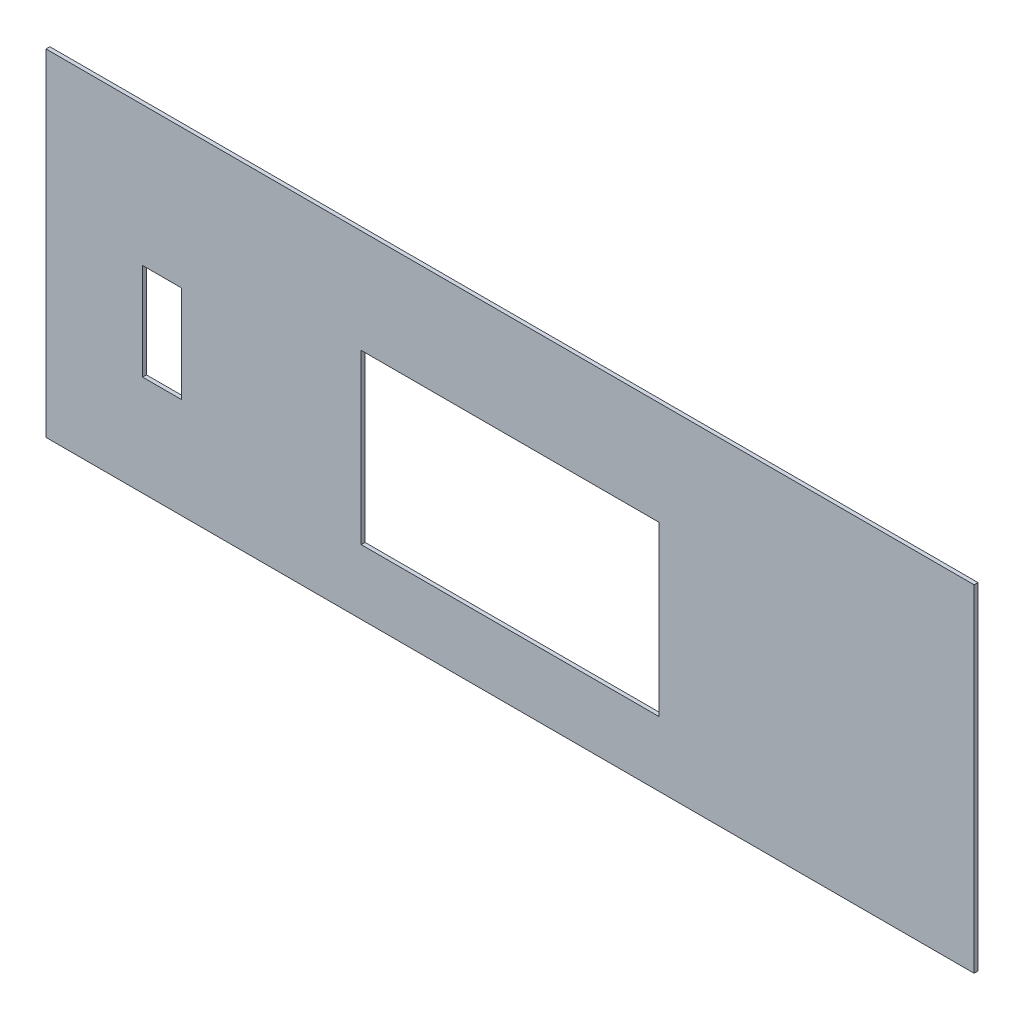
ISO-10303-21;
HEADER;
FILE_DESCRIPTION(('STEP AP214'),'2;1');
FILE_NAME('part.step','',(''),(''),'','','');
FILE_SCHEMA(('AUTOMOTIVE_DESIGN { 1 0 10303 214 1 1 1 1 }'));
ENDSEC;
DATA;
#1=APPLICATION_CONTEXT('core data for automotive mechanical design processes');
#2=APPLICATION_PROTOCOL_DEFINITION('international standard','automotive_design',2000,#1);
#3=PRODUCT_CONTEXT('',#1,'mechanical');
#4=PRODUCT('Part','Part','',(#3));
#5=PRODUCT_RELATED_PRODUCT_CATEGORY('part','',(#4));
#6=PRODUCT_DEFINITION_FORMATION('','',#4);
#7=PRODUCT_DEFINITION_CONTEXT('part definition',#1,'design');
#8=PRODUCT_DEFINITION('design','',#6,#7);
#9=PRODUCT_DEFINITION_SHAPE('','',#8);
#10=(LENGTH_UNIT() NAMED_UNIT(*) SI_UNIT(.MILLI.,.METRE.));
#11=(NAMED_UNIT(*) PLANE_ANGLE_UNIT() SI_UNIT($,.RADIAN.));
#12=(NAMED_UNIT(*) SI_UNIT($,.STERADIAN.) SOLID_ANGLE_UNIT());
#13=UNCERTAINTY_MEASURE_WITH_UNIT(LENGTH_MEASURE(1.E-05),#10,'distance_accuracy_value','');
#14=(GEOMETRIC_REPRESENTATION_CONTEXT(3) GLOBAL_UNCERTAINTY_ASSIGNED_CONTEXT((#13)) GLOBAL_UNIT_ASSIGNED_CONTEXT((#10,
#11,#12)) REPRESENTATION_CONTEXT('',''));
#15=CARTESIAN_POINT('',(0.,0.,0.));
#16=DIRECTION('',(0.,0.,1.));
#17=DIRECTION('',(1.,0.,0.));
#18=AXIS2_PLACEMENT_3D('',#15,#16,#17);
#19=CARTESIAN_POINT('',(240.,-87.,-2.));
#20=DIRECTION('',(1.,0.,0.));
#21=DIRECTION('',(0.,0.,-1.));
#22=AXIS2_PLACEMENT_3D('',#19,#20,#21);
#23=PLANE('',#22);
#24=DIRECTION('',(0.,1.,0.));
#25=VECTOR('',#24,1.);
#26=CARTESIAN_POINT('',(240.,-87.,0.));
#27=LINE('',#26,#25);
#28=CARTESIAN_POINT('',(240.,-87.,0.));
#29=VERTEX_POINT('',#28);
#30=CARTESIAN_POINT('',(240.,87.,0.));
#31=VERTEX_POINT('',#30);
#32=EDGE_CURVE('E184',#29,#31,#27,.T.);
#33=ORIENTED_EDGE('',*,*,#32,.F.);
#34=DIRECTION('',(0.,0.,1.));
#35=VECTOR('',#34,1.);
#36=CARTESIAN_POINT('',(240.,-87.,-2.));
#37=LINE('',#36,#35);
#38=CARTESIAN_POINT('',(240.,-87.,-2.));
#39=VERTEX_POINT('',#38);
#40=EDGE_CURVE('E11',#39,#29,#37,.T.);
#41=ORIENTED_EDGE('',*,*,#40,.F.);
#42=DIRECTION('',(0.,1.,0.));
#43=VECTOR('',#42,1.);
#44=CARTESIAN_POINT('',(240.,-87.,-2.));
#45=LINE('',#44,#43);
#46=CARTESIAN_POINT('',(240.,87.,-2.));
#47=VERTEX_POINT('',#46);
#48=EDGE_CURVE('E191',#39,#47,#45,.T.);
#49=ORIENTED_EDGE('',*,*,#48,.T.);
#50=DIRECTION('',(0.,0.,1.));
#51=VECTOR('',#50,1.);
#52=CARTESIAN_POINT('',(240.,87.,-2.));
#53=LINE('',#52,#51);
#54=EDGE_CURVE('E36',#47,#31,#53,.T.);
#55=ORIENTED_EDGE('',*,*,#54,.T.);
#56=EDGE_LOOP('',(#33,#41,#49,#55));
#57=FACE_BOUND('',#56,.T.);
#58=ADVANCED_FACE('F33',(#57),#23,.T.);
#59=CARTESIAN_POINT('',(-240.,-87.,-2.));
#60=DIRECTION('',(0.,-1.,0.));
#61=DIRECTION('',(0.,0.,-1.));
#62=AXIS2_PLACEMENT_3D('',#59,#60,#61);
#63=PLANE('',#62);
#64=DIRECTION('',(1.,0.,0.));
#65=VECTOR('',#64,1.);
#66=CARTESIAN_POINT('',(-240.,-87.,0.));
#67=LINE('',#66,#65);
#68=CARTESIAN_POINT('',(-240.,-87.,0.));
#69=VERTEX_POINT('',#68);
#70=EDGE_CURVE('E195',#69,#29,#67,.T.);
#71=ORIENTED_EDGE('',*,*,#70,.F.);
#72=DIRECTION('',(0.,0.,1.));
#73=VECTOR('',#72,1.);
#74=CARTESIAN_POINT('',(-240.,-87.,-2.));
#75=LINE('',#74,#73);
#76=CARTESIAN_POINT('',(-240.,-87.,-2.));
#77=VERTEX_POINT('',#76);
#78=EDGE_CURVE('E41',#77,#69,#75,.T.);
#79=ORIENTED_EDGE('',*,*,#78,.F.);
#80=DIRECTION('',(1.,0.,0.));
#81=VECTOR('',#80,1.);
#82=CARTESIAN_POINT('',(-240.,-87.,-2.));
#83=LINE('',#82,#81);
#84=EDGE_CURVE('E201',#77,#39,#83,.T.);
#85=ORIENTED_EDGE('',*,*,#84,.T.);
#86=ORIENTED_EDGE('',*,*,#40,.T.);
#87=EDGE_LOOP('',(#71,#79,#85,#86));
#88=FACE_BOUND('',#87,.T.);
#89=ADVANCED_FACE('F227',(#88),#63,.T.);
#90=CARTESIAN_POINT('',(-240.,-87.,-2.));
#91=DIRECTION('',(-1.,0.,0.));
#92=DIRECTION('',(0.,0.,1.));
#93=AXIS2_PLACEMENT_3D('',#90,#91,#92);
#94=PLANE('',#93);
#95=DIRECTION('',(0.,-1.,0.));
#96=VECTOR('',#95,1.);
#97=CARTESIAN_POINT('',(-240.,-87.,0.));
#98=LINE('',#97,#96);
#99=CARTESIAN_POINT('',(-240.,87.,0.));
#100=VERTEX_POINT('',#99);
#101=EDGE_CURVE('E209',#100,#69,#98,.T.);
#102=ORIENTED_EDGE('',*,*,#101,.F.);
#103=DIRECTION('',(0.,0.,1.));
#104=VECTOR('',#103,1.);
#105=CARTESIAN_POINT('',(-240.,87.,-2.));
#106=LINE('',#105,#104);
#107=CARTESIAN_POINT('',(-240.,87.,-2.));
#108=VERTEX_POINT('',#107);
#109=EDGE_CURVE('E214',#108,#100,#106,.T.);
#110=ORIENTED_EDGE('',*,*,#109,.F.);
#111=DIRECTION('',(0.,-1.,0.));
#112=VECTOR('',#111,1.);
#113=CARTESIAN_POINT('',(-240.,-87.,-2.));
#114=LINE('',#113,#112);
#115=EDGE_CURVE('E198',#108,#77,#114,.T.);
#116=ORIENTED_EDGE('',*,*,#115,.T.);
#117=ORIENTED_EDGE('',*,*,#78,.T.);
#118=EDGE_LOOP('',(#102,#110,#116,#117));
#119=FACE_BOUND('',#118,.T.);
#120=ADVANCED_FACE('F232',(#119),#94,.T.);
#121=CARTESIAN_POINT('',(-240.,87.,-2.));
#122=DIRECTION('',(0.,1.,0.));
#123=DIRECTION('',(0.,0.,1.));
#124=AXIS2_PLACEMENT_3D('',#121,#122,#123);
#125=PLANE('',#124);
#126=DIRECTION('',(-1.,0.,0.));
#127=VECTOR('',#126,1.);
#128=CARTESIAN_POINT('',(-240.,87.,0.));
#129=LINE('',#128,#127);
#130=EDGE_CURVE('E206',#31,#100,#129,.T.);
#131=ORIENTED_EDGE('',*,*,#130,.F.);
#132=ORIENTED_EDGE('',*,*,#54,.F.);
#133=DIRECTION('',(-1.,0.,0.));
#134=VECTOR('',#133,1.);
#135=CARTESIAN_POINT('',(-240.,87.,-2.));
#136=LINE('',#135,#134);
#137=EDGE_CURVE('E194',#47,#108,#136,.T.);
#138=ORIENTED_EDGE('',*,*,#137,.T.);
#139=ORIENTED_EDGE('',*,*,#109,.T.);
#140=EDGE_LOOP('',(#131,#132,#138,#139));
#141=FACE_BOUND('',#140,.T.);
#142=ADVANCED_FACE('F222',(#141),#125,.T.);
#143=CARTESIAN_POINT('',(0.,0.,-2.));
#144=DIRECTION('',(0.,0.,-1.));
#145=DIRECTION('',(-1.,0.,0.));
#146=AXIS2_PLACEMENT_3D('',#143,#144,#145);
#147=PLANE('',#146);
#148=DIRECTION('',(0.,-1.,0.));
#149=VECTOR('',#148,1.);
#150=CARTESIAN_POINT('',(-190.,-35.,-2.));
#151=LINE('',#150,#149);
#152=CARTESIAN_POINT('',(-190.,15.,-2.));
#153=VERTEX_POINT('',#152);
#154=CARTESIAN_POINT('',(-190.,-35.,-2.));
#155=VERTEX_POINT('',#154);
#156=EDGE_CURVE('E124',#153,#155,#151,.T.);
#157=ORIENTED_EDGE('',*,*,#156,.T.);
#158=DIRECTION('',(1.,0.,0.));
#159=VECTOR('',#158,1.);
#160=CARTESIAN_POINT('',(-190.,-35.,-2.));
#161=LINE('',#160,#159);
#162=CARTESIAN_POINT('',(-170.,-35.,-2.));
#163=VERTEX_POINT('',#162);
#164=EDGE_CURVE('E133',#155,#163,#161,.T.);
#165=ORIENTED_EDGE('',*,*,#164,.T.);
#166=DIRECTION('',(0.,1.,0.));
#167=VECTOR('',#166,1.);
#168=CARTESIAN_POINT('',(-170.,-35.,-2.));
#169=LINE('',#168,#167);
#170=CARTESIAN_POINT('',(-170.,15.,-2.));
#171=VERTEX_POINT('',#170);
#172=EDGE_CURVE('E49',#163,#171,#169,.T.);
#173=ORIENTED_EDGE('',*,*,#172,.T.);
#174=DIRECTION('',(-1.,0.,0.));
#175=VECTOR('',#174,1.);
#176=CARTESIAN_POINT('',(-190.,15.,-2.));
#177=LINE('',#176,#175);
#178=EDGE_CURVE('E130',#171,#153,#177,.T.);
#179=ORIENTED_EDGE('',*,*,#178,.T.);
#180=EDGE_LOOP('',(#157,#165,#173,#179));
#181=FACE_BOUND('',#180,.T.);
#182=DIRECTION('',(0.,1.,0.));
#183=VECTOR('',#182,1.);
#184=CARTESIAN_POINT('',(77.,33.5,-2.));
#185=LINE('',#184,#183);
#186=CARTESIAN_POINT('',(77.,-53.5,-2.));
#187=VERTEX_POINT('',#186);
#188=CARTESIAN_POINT('',(77.,33.5,-2.));
#189=VERTEX_POINT('',#188);
#190=EDGE_CURVE('E159',#187,#189,#185,.T.);
#191=ORIENTED_EDGE('',*,*,#190,.T.);
#192=DIRECTION('',(-1.,0.,0.));
#193=VECTOR('',#192,1.);
#194=CARTESIAN_POINT('',(-77.,33.5,-2.));
#195=LINE('',#194,#193);
#196=CARTESIAN_POINT('',(-77.,33.5,-2.));
#197=VERTEX_POINT('',#196);
#198=EDGE_CURVE('E162',#189,#197,#195,.T.);
#199=ORIENTED_EDGE('',*,*,#198,.T.);
#200=DIRECTION('',(0.,-1.,0.));
#201=VECTOR('',#200,1.);
#202=CARTESIAN_POINT('',(-77.,33.5,-2.));
#203=LINE('',#202,#201);
#204=CARTESIAN_POINT('',(-77.,-53.5,-2.));
#205=VERTEX_POINT('',#204);
#206=EDGE_CURVE('E166',#197,#205,#203,.T.);
#207=ORIENTED_EDGE('',*,*,#206,.T.);
#208=DIRECTION('',(1.,0.,0.));
#209=VECTOR('',#208,1.);
#210=CARTESIAN_POINT('',(-77.,-53.5,-2.));
#211=LINE('',#210,#209);
#212=EDGE_CURVE('E169',#205,#187,#211,.T.);
#213=ORIENTED_EDGE('',*,*,#212,.T.);
#214=EDGE_LOOP('',(#191,#199,#207,#213));
#215=FACE_BOUND('',#214,.T.);
#216=ORIENTED_EDGE('',*,*,#48,.F.);
#217=ORIENTED_EDGE('',*,*,#84,.F.);
#218=ORIENTED_EDGE('',*,*,#115,.F.);
#219=ORIENTED_EDGE('',*,*,#137,.F.);
#220=EDGE_LOOP('',(#216,#217,#218,#219));
#221=FACE_BOUND('',#220,.T.);
#222=ADVANCED_FACE('F137',(#181,#215,#221),#147,.T.);
#223=CARTESIAN_POINT('',(0.,0.,0.));
#224=DIRECTION('',(0.,0.,-1.));
#225=DIRECTION('',(-1.,0.,0.));
#226=AXIS2_PLACEMENT_3D('',#223,#224,#225);
#227=PLANE('',#226);
#228=DIRECTION('',(1.,0.,0.));
#229=VECTOR('',#228,1.);
#230=CARTESIAN_POINT('',(-190.,-35.,0.));
#231=LINE('',#230,#229);
#232=CARTESIAN_POINT('',(-190.,-35.,0.));
#233=VERTEX_POINT('',#232);
#234=CARTESIAN_POINT('',(-170.,-35.,0.));
#235=VERTEX_POINT('',#234);
#236=EDGE_CURVE('E149',#233,#235,#231,.T.);
#237=ORIENTED_EDGE('',*,*,#236,.F.);
#238=DIRECTION('',(0.,-1.,0.));
#239=VECTOR('',#238,1.);
#240=CARTESIAN_POINT('',(-190.,-35.,0.));
#241=LINE('',#240,#239);
#242=CARTESIAN_POINT('',(-190.,15.,0.));
#243=VERTEX_POINT('',#242);
#244=EDGE_CURVE('E57',#243,#233,#241,.T.);
#245=ORIENTED_EDGE('',*,*,#244,.F.);
#246=DIRECTION('',(-1.,0.,0.));
#247=VECTOR('',#246,1.);
#248=CARTESIAN_POINT('',(-190.,15.,0.));
#249=LINE('',#248,#247);
#250=CARTESIAN_POINT('',(-170.,15.,0.));
#251=VERTEX_POINT('',#250);
#252=EDGE_CURVE('E140',#251,#243,#249,.T.);
#253=ORIENTED_EDGE('',*,*,#252,.F.);
#254=DIRECTION('',(0.,1.,0.));
#255=VECTOR('',#254,1.);
#256=CARTESIAN_POINT('',(-170.,-35.,0.));
#257=LINE('',#256,#255);
#258=EDGE_CURVE('E143',#235,#251,#257,.T.);
#259=ORIENTED_EDGE('',*,*,#258,.F.);
#260=EDGE_LOOP('',(#237,#245,#253,#259));
#261=FACE_BOUND('',#260,.T.);
#262=DIRECTION('',(-1.,0.,0.));
#263=VECTOR('',#262,1.);
#264=CARTESIAN_POINT('',(-77.,33.5,0.));
#265=LINE('',#264,#263);
#266=CARTESIAN_POINT('',(77.,33.5,0.));
#267=VERTEX_POINT('',#266);
#268=CARTESIAN_POINT('',(-77.,33.5,0.));
#269=VERTEX_POINT('',#268);
#270=EDGE_CURVE('E174',#267,#269,#265,.T.);
#271=ORIENTED_EDGE('',*,*,#270,.F.);
#272=DIRECTION('',(0.,1.,0.));
#273=VECTOR('',#272,1.);
#274=CARTESIAN_POINT('',(77.,33.5,0.));
#275=LINE('',#274,#273);
#276=CARTESIAN_POINT('',(77.,-53.5,0.));
#277=VERTEX_POINT('',#276);
#278=EDGE_CURVE('E155',#277,#267,#275,.T.);
#279=ORIENTED_EDGE('',*,*,#278,.F.);
#280=DIRECTION('',(1.,0.,0.));
#281=VECTOR('',#280,1.);
#282=CARTESIAN_POINT('',(-77.,-53.5,0.));
#283=LINE('',#282,#281);
#284=CARTESIAN_POINT('',(-77.,-53.5,0.));
#285=VERTEX_POINT('',#284);
#286=EDGE_CURVE('E163',#285,#277,#283,.T.);
#287=ORIENTED_EDGE('',*,*,#286,.F.);
#288=DIRECTION('',(0.,-1.,0.));
#289=VECTOR('',#288,1.);
#290=CARTESIAN_POINT('',(-77.,33.5,0.));
#291=LINE('',#290,#289);
#292=EDGE_CURVE('E177',#269,#285,#291,.T.);
#293=ORIENTED_EDGE('',*,*,#292,.F.);
#294=EDGE_LOOP('',(#271,#279,#287,#293));
#295=FACE_BOUND('',#294,.T.);
#296=ORIENTED_EDGE('',*,*,#32,.T.);
#297=ORIENTED_EDGE('',*,*,#130,.T.);
#298=ORIENTED_EDGE('',*,*,#101,.T.);
#299=ORIENTED_EDGE('',*,*,#70,.T.);
#300=EDGE_LOOP('',(#296,#297,#298,#299));
#301=FACE_BOUND('',#300,.T.);
#302=ADVANCED_FACE('F224',(#261,#295,#301),#227,.F.);
#303=CARTESIAN_POINT('',(77.,33.5,-2.));
#304=DIRECTION('',(1.,0.,0.));
#305=DIRECTION('',(0.,1.,0.));
#306=AXIS2_PLACEMENT_3D('',#303,#304,#305);
#307=PLANE('',#306);
#308=ORIENTED_EDGE('',*,*,#278,.T.);
#309=DIRECTION('',(0.,0.,1.));
#310=VECTOR('',#309,1.);
#311=CARTESIAN_POINT('',(77.,33.5,-2.));
#312=LINE('',#311,#310);
#313=EDGE_CURVE('E172',#189,#267,#312,.T.);
#314=ORIENTED_EDGE('',*,*,#313,.F.);
#315=ORIENTED_EDGE('',*,*,#190,.F.);
#316=DIRECTION('',(0.,0.,1.));
#317=VECTOR('',#316,1.);
#318=CARTESIAN_POINT('',(77.,-53.5,-2.));
#319=LINE('',#318,#317);
#320=EDGE_CURVE('E182',#187,#277,#319,.T.);
#321=ORIENTED_EDGE('',*,*,#320,.T.);
#322=EDGE_LOOP('',(#308,#314,#315,#321));
#323=FACE_BOUND('',#322,.T.);
#324=ADVANCED_FACE('F274',(#323),#307,.F.);
#325=CARTESIAN_POINT('',(-77.,-53.5,-2.));
#326=DIRECTION('',(0.,-1.,0.));
#327=DIRECTION('',(0.,0.,-1.));
#328=AXIS2_PLACEMENT_3D('',#325,#326,#327);
#329=PLANE('',#328);
#330=ORIENTED_EDGE('',*,*,#286,.T.);
#331=ORIENTED_EDGE('',*,*,#320,.F.);
#332=ORIENTED_EDGE('',*,*,#212,.F.);
#333=DIRECTION('',(0.,0.,1.));
#334=VECTOR('',#333,1.);
#335=CARTESIAN_POINT('',(-77.,-53.5,-2.));
#336=LINE('',#335,#334);
#337=EDGE_CURVE('E185',#205,#285,#336,.T.);
#338=ORIENTED_EDGE('',*,*,#337,.T.);
#339=EDGE_LOOP('',(#330,#331,#332,#338));
#340=FACE_BOUND('',#339,.T.);
#341=ADVANCED_FACE('F284',(#340),#329,.F.);
#342=CARTESIAN_POINT('',(-77.,33.5,-2.));
#343=DIRECTION('',(-1.,0.,0.));
#344=DIRECTION('',(0.,-1.,0.));
#345=AXIS2_PLACEMENT_3D('',#342,#343,#344);
#346=PLANE('',#345);
#347=ORIENTED_EDGE('',*,*,#292,.T.);
#348=ORIENTED_EDGE('',*,*,#337,.F.);
#349=ORIENTED_EDGE('',*,*,#206,.F.);
#350=DIRECTION('',(0.,0.,1.));
#351=VECTOR('',#350,1.);
#352=CARTESIAN_POINT('',(-77.,33.5,-2.));
#353=LINE('',#352,#351);
#354=EDGE_CURVE('E187',#197,#269,#353,.T.);
#355=ORIENTED_EDGE('',*,*,#354,.T.);
#356=EDGE_LOOP('',(#347,#348,#349,#355));
#357=FACE_BOUND('',#356,.T.);
#358=ADVANCED_FACE('F294',(#357),#346,.F.);
#359=CARTESIAN_POINT('',(-77.,33.5,-2.));
#360=DIRECTION('',(0.,1.,0.));
#361=DIRECTION('',(0.,0.,1.));
#362=AXIS2_PLACEMENT_3D('',#359,#360,#361);
#363=PLANE('',#362);
#364=ORIENTED_EDGE('',*,*,#270,.T.);
#365=ORIENTED_EDGE('',*,*,#354,.F.);
#366=ORIENTED_EDGE('',*,*,#198,.F.);
#367=ORIENTED_EDGE('',*,*,#313,.T.);
#368=EDGE_LOOP('',(#364,#365,#366,#367));
#369=FACE_BOUND('',#368,.T.);
#370=ADVANCED_FACE('F304',(#369),#363,.F.);
#371=CARTESIAN_POINT('',(-190.,-35.,-2.));
#372=DIRECTION('',(-1.,0.,0.));
#373=DIRECTION('',(0.,0.,1.));
#374=AXIS2_PLACEMENT_3D('',#371,#372,#373);
#375=PLANE('',#374);
#376=ORIENTED_EDGE('',*,*,#244,.T.);
#377=DIRECTION('',(0.,0.,1.));
#378=VECTOR('',#377,1.);
#379=CARTESIAN_POINT('',(-190.,-35.,-2.));
#380=LINE('',#379,#378);
#381=EDGE_CURVE('E120',#155,#233,#380,.T.);
#382=ORIENTED_EDGE('',*,*,#381,.F.);
#383=ORIENTED_EDGE('',*,*,#156,.F.);
#384=DIRECTION('',(0.,0.,1.));
#385=VECTOR('',#384,1.);
#386=CARTESIAN_POINT('',(-190.,15.,-2.));
#387=LINE('',#386,#385);
#388=EDGE_CURVE('E153',#153,#243,#387,.T.);
#389=ORIENTED_EDGE('',*,*,#388,.T.);
#390=EDGE_LOOP('',(#376,#382,#383,#389));
#391=FACE_BOUND('',#390,.T.);
#392=ADVANCED_FACE('F122',(#391),#375,.F.);
#393=CARTESIAN_POINT('',(-190.,15.,-2.));
#394=DIRECTION('',(0.,1.,0.));
#395=DIRECTION('',(-1.,0.,0.));
#396=AXIS2_PLACEMENT_3D('',#393,#394,#395);
#397=PLANE('',#396);
#398=ORIENTED_EDGE('',*,*,#252,.T.);
#399=ORIENTED_EDGE('',*,*,#388,.F.);
#400=ORIENTED_EDGE('',*,*,#178,.F.);
#401=DIRECTION('',(0.,0.,1.));
#402=VECTOR('',#401,1.);
#403=CARTESIAN_POINT('',(-170.,15.,-2.));
#404=LINE('',#403,#402);
#405=EDGE_CURVE('E156',#171,#251,#404,.T.);
#406=ORIENTED_EDGE('',*,*,#405,.T.);
#407=EDGE_LOOP('',(#398,#399,#400,#406));
#408=FACE_BOUND('',#407,.T.);
#409=ADVANCED_FACE('F323',(#408),#397,.F.);
#410=CARTESIAN_POINT('',(-170.,-35.,-2.));
#411=DIRECTION('',(1.,0.,0.));
#412=DIRECTION('',(0.,0.,-1.));
#413=AXIS2_PLACEMENT_3D('',#410,#411,#412);
#414=PLANE('',#413);
#415=ORIENTED_EDGE('',*,*,#258,.T.);
#416=ORIENTED_EDGE('',*,*,#405,.F.);
#417=ORIENTED_EDGE('',*,*,#172,.F.);
#418=DIRECTION('',(0.,0.,1.));
#419=VECTOR('',#418,1.);
#420=CARTESIAN_POINT('',(-170.,-35.,-2.));
#421=LINE('',#420,#419);
#422=EDGE_CURVE('E129',#163,#235,#421,.T.);
#423=ORIENTED_EDGE('',*,*,#422,.T.);
#424=EDGE_LOOP('',(#415,#416,#417,#423));
#425=FACE_BOUND('',#424,.T.);
#426=ADVANCED_FACE('F332',(#425),#414,.F.);
#427=CARTESIAN_POINT('',(-190.,-35.,-2.));
#428=DIRECTION('',(0.,-1.,0.));
#429=DIRECTION('',(0.,0.,-1.));
#430=AXIS2_PLACEMENT_3D('',#427,#428,#429);
#431=PLANE('',#430);
#432=ORIENTED_EDGE('',*,*,#236,.T.);
#433=ORIENTED_EDGE('',*,*,#422,.F.);
#434=ORIENTED_EDGE('',*,*,#164,.F.);
#435=ORIENTED_EDGE('',*,*,#381,.T.);
#436=EDGE_LOOP('',(#432,#433,#434,#435));
#437=FACE_BOUND('',#436,.T.);
#438=ADVANCED_FACE('F134',(#437),#431,.F.);
#439=CLOSED_SHELL('',(#58,#89,#120,#142,#222,#302,#324,#341,#358,#370,#392,#409,#426,#438));
#440=MANIFOLD_SOLID_BREP('B2',#439);
#441=ADVANCED_BREP_SHAPE_REPRESENTATION('',(#18,#440),#14);
#442=SHAPE_DEFINITION_REPRESENTATION(#9,#441);
ENDSEC;
END-ISO-10303-21;
